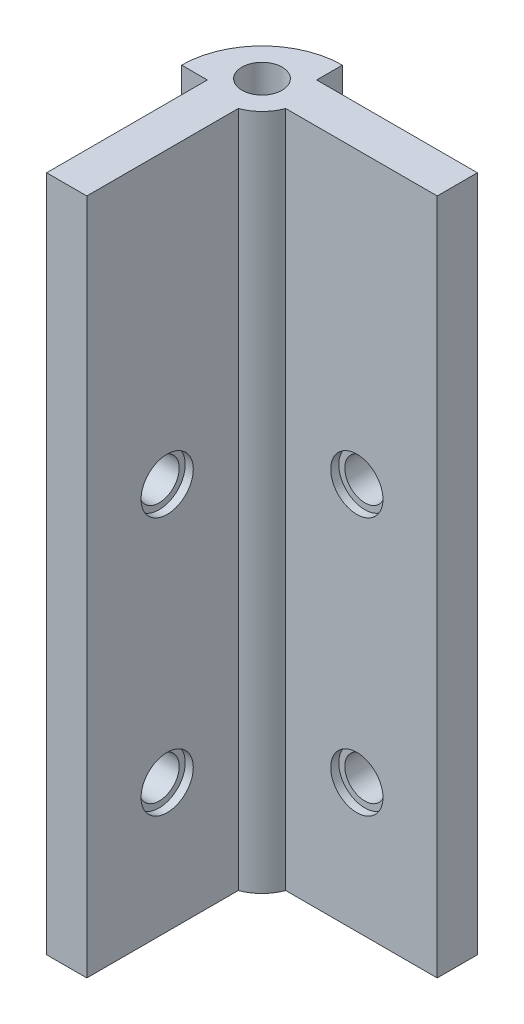
ISO-10303-21;
HEADER;
FILE_DESCRIPTION(('STEP AP214'),'2;1');
FILE_NAME('part.step','',(''),(''),'','','');
FILE_SCHEMA(('AUTOMOTIVE_DESIGN { 1 0 10303 214 1 1 1 1 }'));
ENDSEC;
DATA;
#1=APPLICATION_CONTEXT('core data for automotive mechanical design processes');
#2=APPLICATION_PROTOCOL_DEFINITION('international standard','automotive_design',2000,#1);
#3=PRODUCT_CONTEXT('',#1,'mechanical');
#4=PRODUCT('Part','Part','',(#3));
#5=PRODUCT_RELATED_PRODUCT_CATEGORY('part','',(#4));
#6=PRODUCT_DEFINITION_FORMATION('','',#4);
#7=PRODUCT_DEFINITION_CONTEXT('part definition',#1,'design');
#8=PRODUCT_DEFINITION('design','',#6,#7);
#9=PRODUCT_DEFINITION_SHAPE('','',#8);
#10=(LENGTH_UNIT() NAMED_UNIT(*) SI_UNIT(.MILLI.,.METRE.));
#11=(NAMED_UNIT(*) PLANE_ANGLE_UNIT() SI_UNIT($,.RADIAN.));
#12=(NAMED_UNIT(*) SI_UNIT($,.STERADIAN.) SOLID_ANGLE_UNIT());
#13=UNCERTAINTY_MEASURE_WITH_UNIT(LENGTH_MEASURE(1.E-05),#10,'distance_accuracy_value','');
#14=(GEOMETRIC_REPRESENTATION_CONTEXT(3) GLOBAL_UNCERTAINTY_ASSIGNED_CONTEXT((#13)) GLOBAL_UNIT_ASSIGNED_CONTEXT((#10,
#11,#12)) REPRESENTATION_CONTEXT('',''));
#15=CARTESIAN_POINT('',(0.,0.,0.));
#16=DIRECTION('',(0.,0.,1.));
#17=DIRECTION('',(1.,0.,0.));
#18=AXIS2_PLACEMENT_3D('',#15,#16,#17);
#19=CARTESIAN_POINT('',(3.55965175872163,16.0675,7.49883600615812));
#20=DIRECTION('',(0.,0.,-1.));
#21=DIRECTION('',(-1.,0.,0.));
#22=AXIS2_PLACEMENT_3D('',#19,#20,#21);
#23=CYLINDRICAL_SURFACE('',#22,2.50000000001338);
#24=CARTESIAN_POINT('',(3.55965175872163,16.0675,-19.3011639938371));
#25=DIRECTION('',(0.,0.,-1.));
#26=DIRECTION('',(-1.,0.,0.));
#27=AXIS2_PLACEMENT_3D('',#24,#25,#26);
#28=CIRCLE('',#27,2.50000000001338);
#29=CARTESIAN_POINT('',(1.05965175870825,16.0675,-19.3011639938371));
#30=VERTEX_POINT('',#29);
#31=EDGE_CURVE('E241',#30,#30,#28,.T.);
#32=ORIENTED_EDGE('',*,*,#31,.T.);
#33=EDGE_LOOP('',(#32));
#34=FACE_BOUND('',#33,.T.);
#35=CARTESIAN_POINT('',(3.55965175872163,16.0675,-15.3011639938371));
#36=DIRECTION('',(0.,0.,1.));
#37=DIRECTION('',(1.,0.,0.));
#38=AXIS2_PLACEMENT_3D('',#35,#36,#37);
#39=CIRCLE('',#38,2.50000000001338);
#40=CARTESIAN_POINT('',(6.059651758735,16.0675,-15.3011639938371));
#41=VERTEX_POINT('',#40);
#42=EDGE_CURVE('E42',#41,#41,#39,.F.);
#43=ORIENTED_EDGE('',*,*,#42,.F.);
#44=EDGE_LOOP('',(#43));
#45=FACE_BOUND('',#44,.T.);
#46=ADVANCED_FACE('F38',(#34,#45),#23,.F.);
#47=CARTESIAN_POINT('',(3.55965175872163,48.2025,7.49883600615812));
#48=DIRECTION('',(0.,0.,-1.));
#49=DIRECTION('',(-1.,0.,0.));
#50=AXIS2_PLACEMENT_3D('',#47,#48,#49);
#51=CYLINDRICAL_SURFACE('',#50,2.50000000001338);
#52=CARTESIAN_POINT('',(3.55965175872163,48.2025,-19.3011639938371));
#53=DIRECTION('',(0.,0.,-1.));
#54=DIRECTION('',(-1.,0.,0.));
#55=AXIS2_PLACEMENT_3D('',#52,#53,#54);
#56=CIRCLE('',#55,2.50000000001338);
#57=CARTESIAN_POINT('',(1.05965175870826,48.2025,-19.3011639938371));
#58=VERTEX_POINT('',#57);
#59=EDGE_CURVE('E247',#58,#58,#56,.T.);
#60=ORIENTED_EDGE('',*,*,#59,.T.);
#61=EDGE_LOOP('',(#60));
#62=FACE_BOUND('',#61,.T.);
#63=CARTESIAN_POINT('',(3.55965175872163,48.2025,-15.3011639938371));
#64=DIRECTION('',(0.,0.,1.));
#65=DIRECTION('',(1.,0.,0.));
#66=AXIS2_PLACEMENT_3D('',#63,#64,#65);
#67=CIRCLE('',#66,2.50000000001338);
#68=CARTESIAN_POINT('',(6.05965175873501,48.2025,-15.3011639938371));
#69=VERTEX_POINT('',#68);
#70=EDGE_CURVE('E208',#69,#69,#67,.F.);
#71=ORIENTED_EDGE('',*,*,#70,.F.);
#72=EDGE_LOOP('',(#71));
#73=FACE_BOUND('',#72,.T.);
#74=ADVANCED_FACE('F326',(#62,#73),#51,.F.);
#75=CARTESIAN_POINT('',(13.5596517587216,16.0675,-2.50116399384181));
#76=DIRECTION('',(-1.,0.,0.));
#77=DIRECTION('',(0.,0.,1.));
#78=AXIS2_PLACEMENT_3D('',#75,#76,#77);
#79=CYLINDRICAL_SURFACE('',#78,2.50000000003958);
#80=CARTESIAN_POINT('',(-13.2403482412736,16.0675,-2.50116399384181));
#81=DIRECTION('',(-1.,0.,0.));
#82=DIRECTION('',(0.,0.,1.));
#83=AXIS2_PLACEMENT_3D('',#80,#81,#82);
#84=CIRCLE('',#83,2.50000000003958);
#85=CARTESIAN_POINT('',(-13.2403482412736,16.0675,-0.00116399380223169));
#86=VERTEX_POINT('',#85);
#87=EDGE_CURVE('E242',#86,#86,#84,.T.);
#88=ORIENTED_EDGE('',*,*,#87,.T.);
#89=EDGE_LOOP('',(#88));
#90=FACE_BOUND('',#89,.T.);
#91=CARTESIAN_POINT('',(-9.24034824127362,16.0675,-2.50116399384181));
#92=DIRECTION('',(1.,0.,0.));
#93=DIRECTION('',(0.,0.,-1.));
#94=AXIS2_PLACEMENT_3D('',#91,#92,#93);
#95=CIRCLE('',#94,2.50000000003958);
#96=CARTESIAN_POINT('',(-9.24034824127362,16.0675,-5.00116399388139));
#97=VERTEX_POINT('',#96);
#98=EDGE_CURVE('E246',#97,#97,#95,.F.);
#99=ORIENTED_EDGE('',*,*,#98,.F.);
#100=EDGE_LOOP('',(#99));
#101=FACE_BOUND('',#100,.T.);
#102=ADVANCED_FACE('F332',(#90,#101),#79,.F.);
#103=CARTESIAN_POINT('',(13.5596517587216,48.2025,-2.50116399384181));
#104=DIRECTION('',(-1.,0.,0.));
#105=DIRECTION('',(0.,0.,1.));
#106=AXIS2_PLACEMENT_3D('',#103,#104,#105);
#107=CYLINDRICAL_SURFACE('',#106,2.50000000003958);
#108=CARTESIAN_POINT('',(-13.2403482412736,48.2025,-2.50116399384181));
#109=DIRECTION('',(-1.,0.,0.));
#110=DIRECTION('',(0.,0.,1.));
#111=AXIS2_PLACEMENT_3D('',#108,#109,#110);
#112=CIRCLE('',#111,2.50000000003958);
#113=CARTESIAN_POINT('',(-13.2403482412736,48.2025,-0.00116399380223472));
#114=VERTEX_POINT('',#113);
#115=EDGE_CURVE('E237',#114,#114,#112,.T.);
#116=ORIENTED_EDGE('',*,*,#115,.T.);
#117=EDGE_LOOP('',(#116));
#118=FACE_BOUND('',#117,.T.);
#119=CARTESIAN_POINT('',(-9.24034824127362,48.2025,-2.50116399384181));
#120=DIRECTION('',(1.,0.,0.));
#121=DIRECTION('',(0.,0.,-1.));
#122=AXIS2_PLACEMENT_3D('',#119,#120,#121);
#123=CIRCLE('',#122,2.50000000003958);
#124=CARTESIAN_POINT('',(-9.24034824127362,48.2025,-5.00116399388138));
#125=VERTEX_POINT('',#124);
#126=EDGE_CURVE('E224',#125,#125,#123,.F.);
#127=ORIENTED_EDGE('',*,*,#126,.F.);
#128=EDGE_LOOP('',(#127));
#129=FACE_BOUND('',#128,.T.);
#130=ADVANCED_FACE('F346',(#118,#129),#107,.F.);
#131=CARTESIAN_POINT('',(-9.97588214718333,0.,-16.0366978997468));
#132=DIRECTION('',(0.,-1.,0.));
#133=DIRECTION('',(0.,0.,-1.));
#134=AXIS2_PLACEMENT_3D('',#131,#132,#133);
#135=PLANE('',#134);
#136=DIRECTION('',(0.,0.,-1.));
#137=VECTOR('',#136,1.);
#138=CARTESIAN_POINT('',(13.5596517587216,0.,-19.3011639938371));
#139=LINE('',#138,#137);
#140=CARTESIAN_POINT('',(13.5596517587216,0.,-14.3011639938371));
#141=VERTEX_POINT('',#140);
#142=CARTESIAN_POINT('',(13.5596517587216,0.,-19.3011639938371));
#143=VERTEX_POINT('',#142);
#144=EDGE_CURVE('E258',#141,#143,#139,.T.);
#145=ORIENTED_EDGE('',*,*,#144,.F.);
#146=DIRECTION('',(1.,0.,0.));
#147=VECTOR('',#146,1.);
#148=CARTESIAN_POINT('',(-5.28675407665268,0.,-14.3011639938371));
#149=LINE('',#148,#147);
#150=CARTESIAN_POINT('',(-5.28675407665268,0.,-14.3011639938371));
#151=VERTEX_POINT('',#150);
#152=EDGE_CURVE('E59',#151,#141,#149,.T.);
#153=ORIENTED_EDGE('',*,*,#152,.F.);
#154=CARTESIAN_POINT('',(-9.97588214718333,0.,-16.0366978997468));
#155=DIRECTION('',(0.,1.,0.));
#156=DIRECTION('',(0.,0.,-1.));
#157=AXIS2_PLACEMENT_3D('',#154,#155,#156);
#158=CIRCLE('',#157,5.00000000004007);
#159=CARTESIAN_POINT('',(-8.24034824127362,0.,-11.3475698292162));
#160=VERTEX_POINT('',#159);
#161=EDGE_CURVE('E70',#160,#151,#158,.T.);
#162=ORIENTED_EDGE('',*,*,#161,.F.);
#163=DIRECTION('',(0.,0.,-1.));
#164=VECTOR('',#163,1.);
#165=CARTESIAN_POINT('',(-8.24034824127362,0.,-11.3475698292162));
#166=LINE('',#165,#164);
#167=CARTESIAN_POINT('',(-8.24034824127362,0.,7.49883600615812));
#168=VERTEX_POINT('',#167);
#169=EDGE_CURVE('E279',#168,#160,#166,.T.);
#170=ORIENTED_EDGE('',*,*,#169,.F.);
#171=DIRECTION('',(1.,0.,0.));
#172=VECTOR('',#171,1.);
#173=CARTESIAN_POINT('',(-13.2403482412736,0.,7.49883600615812));
#174=LINE('',#173,#172);
#175=CARTESIAN_POINT('',(-13.2403482412736,0.,7.49883600615812));
#176=VERTEX_POINT('',#175);
#177=EDGE_CURVE('E276',#176,#168,#174,.T.);
#178=ORIENTED_EDGE('',*,*,#177,.F.);
#179=DIRECTION('',(0.,0.,1.));
#180=VECTOR('',#179,1.);
#181=CARTESIAN_POINT('',(-13.2403482412736,0.,-12.5011639938419));
#182=LINE('',#181,#180);
#183=CARTESIAN_POINT('',(-13.2403482412736,0.,-12.5011639938419));
#184=VERTEX_POINT('',#183);
#185=EDGE_CURVE('E273',#184,#176,#182,.T.);
#186=ORIENTED_EDGE('',*,*,#185,.F.);
#187=DIRECTION('',(1.,0.,0.));
#188=VECTOR('',#187,1.);
#189=CARTESIAN_POINT('',(-16.4403482412784,0.,-12.5011639938419));
#190=LINE('',#189,#188);
#191=CARTESIAN_POINT('',(-16.4403482412784,0.,-12.5011639938419));
#192=VERTEX_POINT('',#191);
#193=EDGE_CURVE('E270',#192,#184,#190,.T.);
#194=ORIENTED_EDGE('',*,*,#193,.F.);
#195=CARTESIAN_POINT('',(-6.44034824127834,0.,-12.5011639938419));
#196=DIRECTION('',(0.,1.,0.));
#197=DIRECTION('',(0.,0.,1.));
#198=AXIS2_PLACEMENT_3D('',#195,#196,#197);
#199=CIRCLE('',#198,10.);
#200=CARTESIAN_POINT('',(-6.44034824127837,0.,-22.5011639938419));
#201=VERTEX_POINT('',#200);
#202=EDGE_CURVE('E146',#201,#192,#199,.T.);
#203=ORIENTED_EDGE('',*,*,#202,.F.);
#204=DIRECTION('',(0.,0.,-1.));
#205=VECTOR('',#204,1.);
#206=CARTESIAN_POINT('',(-6.44034824127837,0.,-22.5011639938419));
#207=LINE('',#206,#205);
#208=CARTESIAN_POINT('',(-6.44034824127837,0.,-19.3011639938371));
#209=VERTEX_POINT('',#208);
#210=EDGE_CURVE('E265',#209,#201,#207,.T.);
#211=ORIENTED_EDGE('',*,*,#210,.F.);
#212=DIRECTION('',(-1.,0.,0.));
#213=VECTOR('',#212,1.);
#214=CARTESIAN_POINT('',(-6.44034824127837,0.,-19.3011639938371));
#215=LINE('',#214,#213);
#216=EDGE_CURVE('E262',#143,#209,#215,.T.);
#217=ORIENTED_EDGE('',*,*,#216,.F.);
#218=EDGE_LOOP('',(#145,#153,#162,#170,#178,#186,#194,#203,#211,#217));
#219=FACE_BOUND('',#218,.T.);
#220=CARTESIAN_POINT('',(-9.97588214718333,0.,-16.0366978997468));
#221=DIRECTION('',(0.,1.,0.));
#222=DIRECTION('',(0.,0.,1.));
#223=AXIS2_PLACEMENT_3D('',#220,#221,#222);
#224=CIRCLE('',#223,2.50000000002665);
#225=CARTESIAN_POINT('',(-9.97588214718333,0.,-13.5366978997202));
#226=VERTEX_POINT('',#225);
#227=EDGE_CURVE('E251',#226,#226,#224,.T.);
#228=ORIENTED_EDGE('',*,*,#227,.T.);
#229=EDGE_LOOP('',(#228));
#230=FACE_BOUND('',#229,.T.);
#231=ADVANCED_FACE('F343',(#219,#230),#135,.T.);
#232=CARTESIAN_POINT('',(13.5596517587216,64.27,-19.3011639938371));
#233=DIRECTION('',(-1.,0.,0.));
#234=DIRECTION('',(0.,0.,1.));
#235=AXIS2_PLACEMENT_3D('',#232,#233,#234);
#236=PLANE('',#235);
#237=ORIENTED_EDGE('',*,*,#144,.T.);
#238=DIRECTION('',(0.,-1.,0.));
#239=VECTOR('',#238,1.);
#240=CARTESIAN_POINT('',(13.5596517587216,64.27,-19.3011639938371));
#241=LINE('',#240,#239);
#242=CARTESIAN_POINT('',(13.5596517587216,84.27,-19.3011639938371));
#243=VERTEX_POINT('',#242);
#244=EDGE_CURVE('E11',#243,#143,#241,.T.);
#245=ORIENTED_EDGE('',*,*,#244,.F.);
#246=DIRECTION('',(0.,0.,-1.));
#247=VECTOR('',#246,1.);
#248=CARTESIAN_POINT('',(13.5596517587216,84.27,-19.3011639938371));
#249=LINE('',#248,#247);
#250=CARTESIAN_POINT('',(13.5596517587216,84.27,-14.3011639938371));
#251=VERTEX_POINT('',#250);
#252=EDGE_CURVE('E195',#251,#243,#249,.T.);
#253=ORIENTED_EDGE('',*,*,#252,.F.);
#254=DIRECTION('',(0.,-1.,0.));
#255=VECTOR('',#254,1.);
#256=CARTESIAN_POINT('',(13.5596517587216,64.27,-14.3011639938371));
#257=LINE('',#256,#255);
#258=EDGE_CURVE('E286',#251,#141,#257,.T.);
#259=ORIENTED_EDGE('',*,*,#258,.T.);
#260=EDGE_LOOP('',(#237,#245,#253,#259));
#261=FACE_BOUND('',#260,.T.);
#262=ADVANCED_FACE('F40',(#261),#236,.F.);
#263=CARTESIAN_POINT('',(-6.44034824127837,64.27,-19.3011639938371));
#264=DIRECTION('',(0.,0.,1.));
#265=DIRECTION('',(1.,0.,0.));
#266=AXIS2_PLACEMENT_3D('',#263,#264,#265);
#267=PLANE('',#266);
#268=ORIENTED_EDGE('',*,*,#59,.F.);
#269=EDGE_LOOP('',(#268));
#270=FACE_BOUND('',#269,.T.);
#271=ORIENTED_EDGE('',*,*,#31,.F.);
#272=EDGE_LOOP('',(#271));
#273=FACE_BOUND('',#272,.T.);
#274=ORIENTED_EDGE('',*,*,#216,.T.);
#275=DIRECTION('',(0.,-1.,0.));
#276=VECTOR('',#275,1.);
#277=CARTESIAN_POINT('',(-6.44034824127837,64.27,-19.3011639938371));
#278=LINE('',#277,#276);
#279=CARTESIAN_POINT('',(-6.44034824127837,84.27,-19.3011639938371));
#280=VERTEX_POINT('',#279);
#281=EDGE_CURVE('E48',#280,#209,#278,.T.);
#282=ORIENTED_EDGE('',*,*,#281,.F.);
#283=DIRECTION('',(-1.,0.,0.));
#284=VECTOR('',#283,1.);
#285=CARTESIAN_POINT('',(-6.44034824127837,84.27,-19.3011639938371));
#286=LINE('',#285,#284);
#287=EDGE_CURVE('E199',#243,#280,#286,.T.);
#288=ORIENTED_EDGE('',*,*,#287,.F.);
#289=ORIENTED_EDGE('',*,*,#244,.T.);
#290=EDGE_LOOP('',(#274,#282,#288,#289));
#291=FACE_BOUND('',#290,.T.);
#292=ADVANCED_FACE('F372',(#270,#273,#291),#267,.F.);
#293=CARTESIAN_POINT('',(-6.44034824127837,64.27,-22.5011639938419));
#294=DIRECTION('',(-1.,0.,0.));
#295=DIRECTION('',(0.,0.,1.));
#296=AXIS2_PLACEMENT_3D('',#293,#294,#295);
#297=PLANE('',#296);
#298=ORIENTED_EDGE('',*,*,#210,.T.);
#299=DIRECTION('',(0.,-1.,0.));
#300=VECTOR('',#299,1.);
#301=CARTESIAN_POINT('',(-6.44034824127837,64.27,-22.5011639938419));
#302=LINE('',#301,#300);
#303=CARTESIAN_POINT('',(-6.44034824127838,84.27,-22.5011639938419));
#304=VERTEX_POINT('',#303);
#305=EDGE_CURVE('E150',#304,#201,#302,.T.);
#306=ORIENTED_EDGE('',*,*,#305,.F.);
#307=DIRECTION('',(0.,0.,-1.));
#308=VECTOR('',#307,1.);
#309=CARTESIAN_POINT('',(-6.44034824127838,84.27,-22.5011639938419));
#310=LINE('',#309,#308);
#311=EDGE_CURVE('E168',#280,#304,#310,.T.);
#312=ORIENTED_EDGE('',*,*,#311,.F.);
#313=ORIENTED_EDGE('',*,*,#281,.T.);
#314=EDGE_LOOP('',(#298,#306,#312,#313));
#315=FACE_BOUND('',#314,.T.);
#316=ADVANCED_FACE('F370',(#315),#297,.F.);
#317=CARTESIAN_POINT('',(-6.44034824127834,64.27,-12.5011639938419));
#318=DIRECTION('',(0.,-1.,0.));
#319=DIRECTION('',(0.,0.,-1.));
#320=AXIS2_PLACEMENT_3D('',#317,#318,#319);
#321=CYLINDRICAL_SURFACE('',#320,10.);
#322=ORIENTED_EDGE('',*,*,#202,.T.);
#323=DIRECTION('',(0.,-1.,0.));
#324=VECTOR('',#323,1.);
#325=CARTESIAN_POINT('',(-16.4403482412784,64.27,-12.5011639938419));
#326=LINE('',#325,#324);
#327=CARTESIAN_POINT('',(-16.4403482412784,84.27,-12.5011639938419));
#328=VERTEX_POINT('',#327);
#329=EDGE_CURVE('E139',#328,#192,#326,.T.);
#330=ORIENTED_EDGE('',*,*,#329,.F.);
#331=CARTESIAN_POINT('',(-6.44034824127831,84.27,-12.5011639938418));
#332=DIRECTION('',(0.,1.,0.));
#333=DIRECTION('',(0.,0.,-1.));
#334=AXIS2_PLACEMENT_3D('',#331,#332,#333);
#335=CIRCLE('',#334,10.);
#336=EDGE_CURVE('E144',#304,#328,#335,.T.);
#337=ORIENTED_EDGE('',*,*,#336,.F.);
#338=ORIENTED_EDGE('',*,*,#305,.T.);
#339=EDGE_LOOP('',(#322,#330,#337,#338));
#340=FACE_BOUND('',#339,.T.);
#341=ADVANCED_FACE('F141',(#340),#321,.T.);
#342=CARTESIAN_POINT('',(-16.4403482412784,64.27,-12.5011639938419));
#343=DIRECTION('',(0.,0.,-1.));
#344=DIRECTION('',(-1.,0.,0.));
#345=AXIS2_PLACEMENT_3D('',#342,#343,#344);
#346=PLANE('',#345);
#347=ORIENTED_EDGE('',*,*,#193,.T.);
#348=DIRECTION('',(0.,-1.,0.));
#349=VECTOR('',#348,1.);
#350=CARTESIAN_POINT('',(-13.2403482412736,64.27,-12.5011639938419));
#351=LINE('',#350,#349);
#352=CARTESIAN_POINT('',(-13.2403482412736,84.27,-12.5011639938419));
#353=VERTEX_POINT('',#352);
#354=EDGE_CURVE('E151',#353,#184,#351,.T.);
#355=ORIENTED_EDGE('',*,*,#354,.F.);
#356=DIRECTION('',(1.,0.,0.));
#357=VECTOR('',#356,1.);
#358=CARTESIAN_POINT('',(-13.2403482412736,84.27,-12.5011639938419));
#359=LINE('',#358,#357);
#360=EDGE_CURVE('E154',#328,#353,#359,.T.);
#361=ORIENTED_EDGE('',*,*,#360,.F.);
#362=ORIENTED_EDGE('',*,*,#329,.T.);
#363=EDGE_LOOP('',(#347,#355,#361,#362));
#364=FACE_BOUND('',#363,.T.);
#365=ADVANCED_FACE('F155',(#364),#346,.F.);
#366=CARTESIAN_POINT('',(-13.2403482412736,64.27,-12.5011639938419));
#367=DIRECTION('',(1.,0.,0.));
#368=DIRECTION('',(0.,0.,-1.));
#369=AXIS2_PLACEMENT_3D('',#366,#367,#368);
#370=PLANE('',#369);
#371=ORIENTED_EDGE('',*,*,#115,.F.);
#372=EDGE_LOOP('',(#371));
#373=FACE_BOUND('',#372,.T.);
#374=ORIENTED_EDGE('',*,*,#87,.F.);
#375=EDGE_LOOP('',(#374));
#376=FACE_BOUND('',#375,.T.);
#377=ORIENTED_EDGE('',*,*,#185,.T.);
#378=DIRECTION('',(0.,-1.,0.));
#379=VECTOR('',#378,1.);
#380=CARTESIAN_POINT('',(-13.2403482412736,64.27,7.49883600615812));
#381=LINE('',#380,#379);
#382=CARTESIAN_POINT('',(-13.2403482412736,84.27,7.49883600615812));
#383=VERTEX_POINT('',#382);
#384=EDGE_CURVE('E299',#383,#176,#381,.T.);
#385=ORIENTED_EDGE('',*,*,#384,.F.);
#386=DIRECTION('',(0.,0.,1.));
#387=VECTOR('',#386,1.);
#388=CARTESIAN_POINT('',(-13.2403482412736,84.27,7.49883600615812));
#389=LINE('',#388,#387);
#390=EDGE_CURVE('E161',#353,#383,#389,.T.);
#391=ORIENTED_EDGE('',*,*,#390,.F.);
#392=ORIENTED_EDGE('',*,*,#354,.T.);
#393=EDGE_LOOP('',(#377,#385,#391,#392));
#394=FACE_BOUND('',#393,.T.);
#395=ADVANCED_FACE('F361',(#373,#376,#394),#370,.F.);
#396=CARTESIAN_POINT('',(-13.2403482412736,64.27,7.49883600615812));
#397=DIRECTION('',(0.,0.,-1.));
#398=DIRECTION('',(-1.,0.,0.));
#399=AXIS2_PLACEMENT_3D('',#396,#397,#398);
#400=PLANE('',#399);
#401=ORIENTED_EDGE('',*,*,#177,.T.);
#402=DIRECTION('',(0.,-1.,0.));
#403=VECTOR('',#402,1.);
#404=CARTESIAN_POINT('',(-8.24034824127362,64.27,7.49883600615812));
#405=LINE('',#404,#403);
#406=CARTESIAN_POINT('',(-8.24034824127362,84.27,7.49883600615812));
#407=VERTEX_POINT('',#406);
#408=EDGE_CURVE('E295',#407,#168,#405,.T.);
#409=ORIENTED_EDGE('',*,*,#408,.F.);
#410=DIRECTION('',(1.,0.,0.));
#411=VECTOR('',#410,1.);
#412=CARTESIAN_POINT('',(-8.24034824127362,84.27,7.49883600615812));
#413=LINE('',#412,#411);
#414=EDGE_CURVE('E179',#383,#407,#413,.T.);
#415=ORIENTED_EDGE('',*,*,#414,.F.);
#416=ORIENTED_EDGE('',*,*,#384,.T.);
#417=EDGE_LOOP('',(#401,#409,#415,#416));
#418=FACE_BOUND('',#417,.T.);
#419=ADVANCED_FACE('F357',(#418),#400,.F.);
#420=CARTESIAN_POINT('',(-8.24034824127362,64.27,-11.3475698292162));
#421=DIRECTION('',(-1.,0.,0.));
#422=DIRECTION('',(0.,0.,1.));
#423=AXIS2_PLACEMENT_3D('',#420,#421,#422);
#424=PLANE('',#423);
#425=CARTESIAN_POINT('',(-8.24034824127362,48.2025,-2.50116399384181));
#426=DIRECTION('',(1.,0.,0.));
#427=DIRECTION('',(0.,0.,-1.));
#428=AXIS2_PLACEMENT_3D('',#425,#426,#427);
#429=CIRCLE('',#428,3.25);
#430=CARTESIAN_POINT('',(-8.24034824127362,48.2025,-5.75116399384181));
#431=VERTEX_POINT('',#430);
#432=EDGE_CURVE('E225',#431,#431,#429,.T.);
#433=ORIENTED_EDGE('',*,*,#432,.F.);
#434=EDGE_LOOP('',(#433));
#435=FACE_BOUND('',#434,.T.);
#436=CARTESIAN_POINT('',(-8.24034824127362,16.0675,-2.50116399384181));
#437=DIRECTION('',(1.,0.,0.));
#438=DIRECTION('',(0.,0.,-1.));
#439=AXIS2_PLACEMENT_3D('',#436,#437,#438);
#440=CIRCLE('',#439,3.25);
#441=CARTESIAN_POINT('',(-8.24034824127362,16.0675,-5.75116399384181));
#442=VERTEX_POINT('',#441);
#443=EDGE_CURVE('E233',#442,#442,#440,.T.);
#444=ORIENTED_EDGE('',*,*,#443,.F.);
#445=EDGE_LOOP('',(#444));
#446=FACE_BOUND('',#445,.T.);
#447=ORIENTED_EDGE('',*,*,#169,.T.);
#448=DIRECTION('',(0.,-1.,0.));
#449=VECTOR('',#448,1.);
#450=CARTESIAN_POINT('',(-8.24034824127362,64.27,-11.3475698292162));
#451=LINE('',#450,#449);
#452=CARTESIAN_POINT('',(-8.24034824127362,84.27,-11.3475698292162));
#453=VERTEX_POINT('',#452);
#454=EDGE_CURVE('E292',#453,#160,#451,.T.);
#455=ORIENTED_EDGE('',*,*,#454,.F.);
#456=DIRECTION('',(0.,0.,-1.));
#457=VECTOR('',#456,1.);
#458=CARTESIAN_POINT('',(-8.24034824127362,84.27,-11.3475698292162));
#459=LINE('',#458,#457);
#460=EDGE_CURVE('E183',#407,#453,#459,.T.);
#461=ORIENTED_EDGE('',*,*,#460,.F.);
#462=ORIENTED_EDGE('',*,*,#408,.T.);
#463=EDGE_LOOP('',(#447,#455,#461,#462));
#464=FACE_BOUND('',#463,.T.);
#465=ADVANCED_FACE('F354',(#435,#446,#464),#424,.F.);
#466=CARTESIAN_POINT('',(-9.97588214718333,64.27,-16.0366978997468));
#467=DIRECTION('',(0.,-1.,0.));
#468=DIRECTION('',(0.,0.,-1.));
#469=AXIS2_PLACEMENT_3D('',#466,#467,#468);
#470=CYLINDRICAL_SURFACE('',#469,5.00000000004007);
#471=ORIENTED_EDGE('',*,*,#161,.T.);
#472=DIRECTION('',(0.,-1.,0.));
#473=VECTOR('',#472,1.);
#474=CARTESIAN_POINT('',(-5.28675407665268,64.27,-14.3011639938371));
#475=LINE('',#474,#473);
#476=CARTESIAN_POINT('',(-5.28675407665268,84.27,-14.3011639938371));
#477=VERTEX_POINT('',#476);
#478=EDGE_CURVE('E289',#477,#151,#475,.T.);
#479=ORIENTED_EDGE('',*,*,#478,.F.);
#480=CARTESIAN_POINT('',(-9.97588214718333,84.27,-16.0366978997468));
#481=DIRECTION('',(0.,1.,0.));
#482=DIRECTION('',(0.,0.,-1.));
#483=AXIS2_PLACEMENT_3D('',#480,#481,#482);
#484=CIRCLE('',#483,5.00000000004007);
#485=EDGE_CURVE('E187',#453,#477,#484,.T.);
#486=ORIENTED_EDGE('',*,*,#485,.F.);
#487=ORIENTED_EDGE('',*,*,#454,.T.);
#488=EDGE_LOOP('',(#471,#479,#486,#487));
#489=FACE_BOUND('',#488,.T.);
#490=ADVANCED_FACE('F350',(#489),#470,.T.);
#491=CARTESIAN_POINT('',(-5.28675407665268,64.27,-14.3011639938371));
#492=DIRECTION('',(0.,0.,-1.));
#493=DIRECTION('',(-1.,0.,0.));
#494=AXIS2_PLACEMENT_3D('',#491,#492,#493);
#495=PLANE('',#494);
#496=CARTESIAN_POINT('',(3.55965175872163,48.2025,-14.3011639938371));
#497=DIRECTION('',(0.,0.,1.));
#498=DIRECTION('',(1.,0.,0.));
#499=AXIS2_PLACEMENT_3D('',#496,#497,#498);
#500=CIRCLE('',#499,3.24999999998663);
#501=CARTESIAN_POINT('',(6.80965175870826,48.2025,-14.3011639938371));
#502=VERTEX_POINT('',#501);
#503=EDGE_CURVE('E209',#502,#502,#500,.T.);
#504=ORIENTED_EDGE('',*,*,#503,.F.);
#505=EDGE_LOOP('',(#504));
#506=FACE_BOUND('',#505,.T.);
#507=CARTESIAN_POINT('',(3.55965175872163,16.0675,-14.3011639938371));
#508=DIRECTION('',(0.,0.,1.));
#509=DIRECTION('',(1.,0.,0.));
#510=AXIS2_PLACEMENT_3D('',#507,#508,#509);
#511=CIRCLE('',#510,3.24999999998663);
#512=CARTESIAN_POINT('',(6.80965175870826,16.0675,-14.3011639938371));
#513=VERTEX_POINT('',#512);
#514=EDGE_CURVE('E203',#513,#513,#511,.T.);
#515=ORIENTED_EDGE('',*,*,#514,.F.);
#516=EDGE_LOOP('',(#515));
#517=FACE_BOUND('',#516,.T.);
#518=ORIENTED_EDGE('',*,*,#152,.T.);
#519=ORIENTED_EDGE('',*,*,#258,.F.);
#520=DIRECTION('',(1.,0.,0.));
#521=VECTOR('',#520,1.);
#522=CARTESIAN_POINT('',(13.5596517587216,84.27,-14.3011639938371));
#523=LINE('',#522,#521);
#524=EDGE_CURVE('E191',#477,#251,#523,.T.);
#525=ORIENTED_EDGE('',*,*,#524,.F.);
#526=ORIENTED_EDGE('',*,*,#478,.T.);
#527=EDGE_LOOP('',(#518,#519,#525,#526));
#528=FACE_BOUND('',#527,.T.);
#529=ADVANCED_FACE('F341',(#506,#517,#528),#495,.F.);
#530=CARTESIAN_POINT('',(-9.97588214718333,64.27,-16.0366978997468));
#531=DIRECTION('',(0.,-1.,0.));
#532=DIRECTION('',(0.,0.,-1.));
#533=AXIS2_PLACEMENT_3D('',#530,#531,#532);
#534=CYLINDRICAL_SURFACE('',#533,2.50000000002665);
#535=ORIENTED_EDGE('',*,*,#227,.F.);
#536=EDGE_LOOP('',(#535));
#537=FACE_BOUND('',#536,.T.);
#538=CARTESIAN_POINT('',(-9.97588214718333,84.27,-16.0366978997468));
#539=DIRECTION('',(0.,1.,0.));
#540=DIRECTION('',(0.,0.,1.));
#541=AXIS2_PLACEMENT_3D('',#538,#539,#540);
#542=CIRCLE('',#541,2.50000000002665);
#543=CARTESIAN_POINT('',(-9.97588214718333,84.27,-13.5366978997202));
#544=VERTEX_POINT('',#543);
#545=EDGE_CURVE('E170',#544,#544,#542,.T.);
#546=ORIENTED_EDGE('',*,*,#545,.T.);
#547=EDGE_LOOP('',(#546));
#548=FACE_BOUND('',#547,.T.);
#549=ADVANCED_FACE('F337',(#537,#548),#534,.F.);
#550=CARTESIAN_POINT('',(-9.24034824127362,48.2025,-2.50116399384181));
#551=DIRECTION('',(1.,0.,0.));
#552=DIRECTION('',(0.,0.,-1.));
#553=AXIS2_PLACEMENT_3D('',#550,#551,#552);
#554=PLANE('',#553);
#555=CARTESIAN_POINT('',(-9.24034824127362,48.2025,-2.50116399384181));
#556=DIRECTION('',(1.,0.,0.));
#557=DIRECTION('',(0.,0.,-1.));
#558=AXIS2_PLACEMENT_3D('',#555,#556,#557);
#559=CIRCLE('',#558,3.25);
#560=CARTESIAN_POINT('',(-9.24034824127362,48.2025,-5.75116399384181));
#561=VERTEX_POINT('',#560);
#562=EDGE_CURVE('E220',#561,#561,#559,.T.);
#563=ORIENTED_EDGE('',*,*,#562,.T.);
#564=EDGE_LOOP('',(#563));
#565=FACE_BOUND('',#564,.T.);
#566=ORIENTED_EDGE('',*,*,#126,.T.);
#567=EDGE_LOOP('',(#566));
#568=FACE_BOUND('',#567,.T.);
#569=ADVANCED_FACE('F340',(#565,#568),#554,.T.);
#570=CARTESIAN_POINT('',(-9.24034824127362,48.2025,-2.50116399384181));
#571=DIRECTION('',(1.,0.,0.));
#572=DIRECTION('',(0.,0.,-1.));
#573=AXIS2_PLACEMENT_3D('',#570,#571,#572);
#574=CYLINDRICAL_SURFACE('',#573,3.25);
#575=ORIENTED_EDGE('',*,*,#562,.F.);
#576=EDGE_LOOP('',(#575));
#577=FACE_BOUND('',#576,.T.);
#578=ORIENTED_EDGE('',*,*,#432,.T.);
#579=EDGE_LOOP('',(#578));
#580=FACE_BOUND('',#579,.T.);
#581=ADVANCED_FACE('F424',(#577,#580),#574,.F.);
#582=CARTESIAN_POINT('',(-9.24034824127362,16.0675,-2.50116399384181));
#583=DIRECTION('',(1.,0.,0.));
#584=DIRECTION('',(0.,0.,-1.));
#585=AXIS2_PLACEMENT_3D('',#582,#583,#584);
#586=PLANE('',#585);
#587=CARTESIAN_POINT('',(-9.24034824127362,16.0675,-2.50116399384181));
#588=DIRECTION('',(1.,0.,0.));
#589=DIRECTION('',(0.,0.,-1.));
#590=AXIS2_PLACEMENT_3D('',#587,#588,#589);
#591=CIRCLE('',#590,3.25);
#592=CARTESIAN_POINT('',(-9.24034824127362,16.0675,-5.75116399384181));
#593=VERTEX_POINT('',#592);
#594=EDGE_CURVE('E229',#593,#593,#591,.T.);
#595=ORIENTED_EDGE('',*,*,#594,.T.);
#596=EDGE_LOOP('',(#595));
#597=FACE_BOUND('',#596,.T.);
#598=ORIENTED_EDGE('',*,*,#98,.T.);
#599=EDGE_LOOP('',(#598));
#600=FACE_BOUND('',#599,.T.);
#601=ADVANCED_FACE('F428',(#597,#600),#586,.T.);
#602=CARTESIAN_POINT('',(-9.24034824127362,16.0675,-2.50116399384181));
#603=DIRECTION('',(1.,0.,0.));
#604=DIRECTION('',(0.,0.,-1.));
#605=AXIS2_PLACEMENT_3D('',#602,#603,#604);
#606=CYLINDRICAL_SURFACE('',#605,3.25);
#607=ORIENTED_EDGE('',*,*,#594,.F.);
#608=EDGE_LOOP('',(#607));
#609=FACE_BOUND('',#608,.T.);
#610=ORIENTED_EDGE('',*,*,#443,.T.);
#611=EDGE_LOOP('',(#610));
#612=FACE_BOUND('',#611,.T.);
#613=ADVANCED_FACE('F414',(#609,#612),#606,.F.);
#614=CARTESIAN_POINT('',(3.55965175872163,48.2025,-15.3011639938371));
#615=DIRECTION('',(0.,0.,1.));
#616=DIRECTION('',(1.,0.,0.));
#617=AXIS2_PLACEMENT_3D('',#614,#615,#616);
#618=PLANE('',#617);
#619=CARTESIAN_POINT('',(3.55965175872163,48.2025,-15.3011639938371));
#620=DIRECTION('',(0.,0.,1.));
#621=DIRECTION('',(1.,0.,0.));
#622=AXIS2_PLACEMENT_3D('',#619,#620,#621);
#623=CIRCLE('',#622,3.24999999998663);
#624=CARTESIAN_POINT('',(6.80965175870826,48.2025,-15.3011639938371));
#625=VERTEX_POINT('',#624);
#626=EDGE_CURVE('E204',#625,#625,#623,.T.);
#627=ORIENTED_EDGE('',*,*,#626,.T.);
#628=EDGE_LOOP('',(#627));
#629=FACE_BOUND('',#628,.T.);
#630=ORIENTED_EDGE('',*,*,#70,.T.);
#631=EDGE_LOOP('',(#630));
#632=FACE_BOUND('',#631,.T.);
#633=ADVANCED_FACE('F410',(#629,#632),#618,.T.);
#634=CARTESIAN_POINT('',(3.55965175872163,48.2025,-15.3011639938371));
#635=DIRECTION('',(0.,0.,1.));
#636=DIRECTION('',(1.,0.,0.));
#637=AXIS2_PLACEMENT_3D('',#634,#635,#636);
#638=CYLINDRICAL_SURFACE('',#637,3.24999999998663);
#639=ORIENTED_EDGE('',*,*,#626,.F.);
#640=EDGE_LOOP('',(#639));
#641=FACE_BOUND('',#640,.T.);
#642=ORIENTED_EDGE('',*,*,#503,.T.);
#643=EDGE_LOOP('',(#642));
#644=FACE_BOUND('',#643,.T.);
#645=ADVANCED_FACE('F413',(#641,#644),#638,.F.);
#646=CARTESIAN_POINT('',(3.55965175872163,16.0675,-15.3011639938371));
#647=DIRECTION('',(0.,0.,1.));
#648=DIRECTION('',(1.,0.,0.));
#649=AXIS2_PLACEMENT_3D('',#646,#647,#648);
#650=PLANE('',#649);
#651=CARTESIAN_POINT('',(3.55965175872163,16.0675,-15.3011639938371));
#652=DIRECTION('',(0.,0.,1.));
#653=DIRECTION('',(1.,0.,0.));
#654=AXIS2_PLACEMENT_3D('',#651,#652,#653);
#655=CIRCLE('',#654,3.24999999998663);
#656=CARTESIAN_POINT('',(6.80965175870826,16.0675,-15.3011639938371));
#657=VERTEX_POINT('',#656);
#658=EDGE_CURVE('E213',#657,#657,#655,.T.);
#659=ORIENTED_EDGE('',*,*,#658,.T.);
#660=EDGE_LOOP('',(#659));
#661=FACE_BOUND('',#660,.T.);
#662=ORIENTED_EDGE('',*,*,#42,.T.);
#663=EDGE_LOOP('',(#662));
#664=FACE_BOUND('',#663,.T.);
#665=ADVANCED_FACE('F323',(#661,#664),#650,.T.);
#666=CARTESIAN_POINT('',(3.55965175872163,16.0675,-15.3011639938371));
#667=DIRECTION('',(0.,0.,1.));
#668=DIRECTION('',(1.,0.,0.));
#669=AXIS2_PLACEMENT_3D('',#666,#667,#668);
#670=CYLINDRICAL_SURFACE('',#669,3.24999999998663);
#671=ORIENTED_EDGE('',*,*,#658,.F.);
#672=EDGE_LOOP('',(#671));
#673=FACE_BOUND('',#672,.T.);
#674=ORIENTED_EDGE('',*,*,#514,.T.);
#675=EDGE_LOOP('',(#674));
#676=FACE_BOUND('',#675,.T.);
#677=ADVANCED_FACE('F402',(#673,#676),#670,.F.);
#678=CARTESIAN_POINT('',(-6.44034824127831,84.27,-12.5011639938418));
#679=DIRECTION('',(0.,-1.,0.));
#680=DIRECTION('',(0.,0.,-1.));
#681=AXIS2_PLACEMENT_3D('',#678,#679,#680);
#682=PLANE('',#681);
#683=ORIENTED_EDGE('',*,*,#336,.T.);
#684=ORIENTED_EDGE('',*,*,#360,.T.);
#685=ORIENTED_EDGE('',*,*,#390,.T.);
#686=ORIENTED_EDGE('',*,*,#414,.T.);
#687=ORIENTED_EDGE('',*,*,#460,.T.);
#688=ORIENTED_EDGE('',*,*,#485,.T.);
#689=ORIENTED_EDGE('',*,*,#524,.T.);
#690=ORIENTED_EDGE('',*,*,#252,.T.);
#691=ORIENTED_EDGE('',*,*,#287,.T.);
#692=ORIENTED_EDGE('',*,*,#311,.T.);
#693=EDGE_LOOP('',(#683,#684,#685,#686,#687,#688,#689,#690,#691,#692));
#694=FACE_BOUND('',#693,.T.);
#695=ORIENTED_EDGE('',*,*,#545,.F.);
#696=EDGE_LOOP('',(#695));
#697=FACE_BOUND('',#696,.T.);
#698=ADVANCED_FACE('F164',(#694,#697),#682,.F.);
#699=CLOSED_SHELL('',(#46,#74,#102,#130,#231,#262,#292,#316,#341,#365,#395,#419,#465,#490,#529,
#549,#569,#581,#601,#613,#633,#645,#665,#677,#698));
#700=MANIFOLD_SOLID_BREP('B2',#699);
#701=ADVANCED_BREP_SHAPE_REPRESENTATION('',(#18,#700),#14);
#702=SHAPE_DEFINITION_REPRESENTATION(#9,#701);
ENDSEC;
END-ISO-10303-21;
